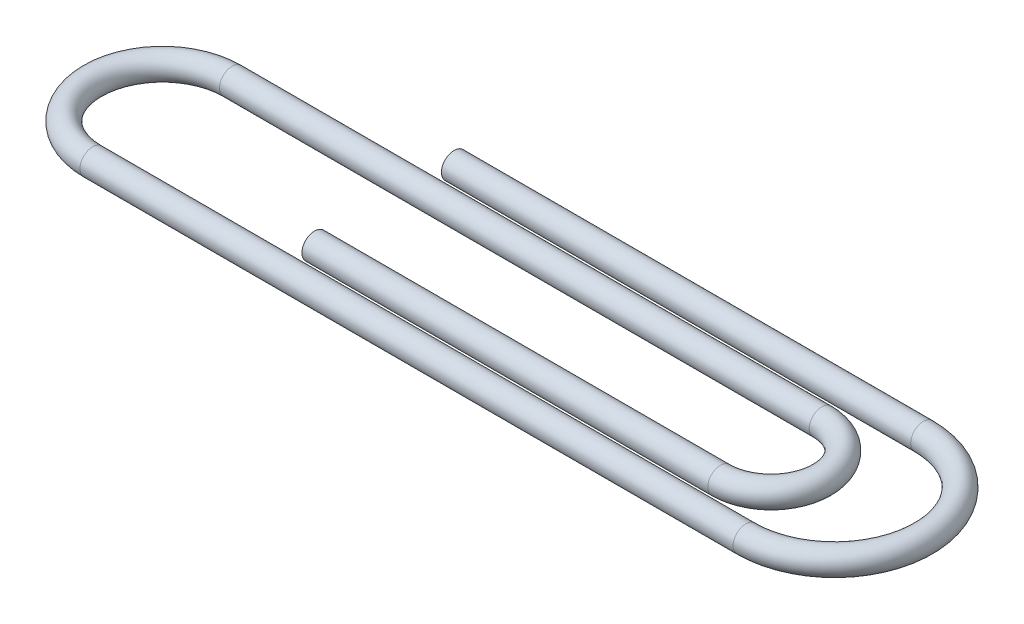
ISO-10303-21;
HEADER;
FILE_DESCRIPTION(('STEP AP214'),'2;1');
FILE_NAME('part.step','',(''),(''),'','','');
FILE_SCHEMA(('AUTOMOTIVE_DESIGN { 1 0 10303 214 1 1 1 1 }'));
ENDSEC;
DATA;
#1=APPLICATION_CONTEXT('core data for automotive mechanical design processes');
#2=APPLICATION_PROTOCOL_DEFINITION('international standard','automotive_design',2000,#1);
#3=PRODUCT_CONTEXT('',#1,'mechanical');
#4=PRODUCT('Part','Part','',(#3));
#5=PRODUCT_RELATED_PRODUCT_CATEGORY('part','',(#4));
#6=PRODUCT_DEFINITION_FORMATION('','',#4);
#7=PRODUCT_DEFINITION_CONTEXT('part definition',#1,'design');
#8=PRODUCT_DEFINITION('design','',#6,#7);
#9=PRODUCT_DEFINITION_SHAPE('','',#8);
#10=(LENGTH_UNIT() NAMED_UNIT(*) SI_UNIT(.MILLI.,.METRE.));
#11=(NAMED_UNIT(*) PLANE_ANGLE_UNIT() SI_UNIT($,.RADIAN.));
#12=(NAMED_UNIT(*) SI_UNIT($,.STERADIAN.) SOLID_ANGLE_UNIT());
#13=UNCERTAINTY_MEASURE_WITH_UNIT(LENGTH_MEASURE(1.E-05),#10,'distance_accuracy_value','');
#14=(GEOMETRIC_REPRESENTATION_CONTEXT(3) GLOBAL_UNCERTAINTY_ASSIGNED_CONTEXT((#13)) GLOBAL_UNIT_ASSIGNED_CONTEXT((#10,
#11,#12)) REPRESENTATION_CONTEXT('',''));
#15=CARTESIAN_POINT('',(0.,0.,0.));
#16=DIRECTION('',(0.,0.,1.));
#17=DIRECTION('',(1.,0.,0.));
#18=AXIS2_PLACEMENT_3D('',#15,#16,#17);
#19=CARTESIAN_POINT('',(0.,0.,0.));
#20=DIRECTION('',(1.,0.,0.));
#21=DIRECTION('',(0.,0.,-1.));
#22=AXIS2_PLACEMENT_3D('',#19,#20,#21);
#23=PLANE('',#22);
#24=CARTESIAN_POINT('',(0.,0.,0.));
#25=DIRECTION('',(1.,0.,0.));
#26=DIRECTION('',(0.,0.,-1.));
#27=AXIS2_PLACEMENT_3D('',#24,#25,#26);
#28=CIRCLE('',#27,0.5);
#29=CARTESIAN_POINT('',(0.,0.,-0.5));
#30=VERTEX_POINT('',#29);
#31=EDGE_CURVE('E72',#30,#30,#28,.T.);
#32=ORIENTED_EDGE('',*,*,#31,.F.);
#33=EDGE_LOOP('',(#32));
#34=FACE_BOUND('',#33,.T.);
#35=ADVANCED_FACE('F37',(#34),#23,.F.);
#36=CARTESIAN_POINT('',(0.,0.,5.5));
#37=DIRECTION('',(-1.,0.,0.));
#38=DIRECTION('',(0.,0.,1.));
#39=AXIS2_PLACEMENT_3D('',#36,#37,#38);
#40=PLANE('',#39);
#41=CARTESIAN_POINT('',(0.,0.,5.5));
#42=DIRECTION('',(-1.,0.,0.));
#43=DIRECTION('',(0.,0.,1.));
#44=AXIS2_PLACEMENT_3D('',#41,#42,#43);
#45=CIRCLE('',#44,0.5);
#46=CARTESIAN_POINT('',(0.,0.,6.));
#47=VERTEX_POINT('',#46);
#48=EDGE_CURVE('E10',#47,#47,#45,.T.);
#49=ORIENTED_EDGE('',*,*,#48,.T.);
#50=EDGE_LOOP('',(#49));
#51=FACE_BOUND('',#50,.T.);
#52=ADVANCED_FACE('F80',(#51),#40,.T.);
#53=CARTESIAN_POINT('',(0.,0.,0.));
#54=DIRECTION('',(1.,0.,0.));
#55=DIRECTION('',(0.,0.,-1.));
#56=AXIS2_PLACEMENT_3D('',#53,#54,#55);
#57=CYLINDRICAL_SURFACE('',#56,0.5);
#58=CARTESIAN_POINT('',(18.5,0.,0.));
#59=DIRECTION('',(1.,0.,0.));
#60=DIRECTION('',(0.,0.,-1.));
#61=AXIS2_PLACEMENT_3D('',#58,#59,#60);
#62=CIRCLE('',#61,0.5);
#63=CARTESIAN_POINT('',(18.5,0.,-0.5));
#64=VERTEX_POINT('',#63);
#65=EDGE_CURVE('E68',#64,#64,#62,.T.);
#66=ORIENTED_EDGE('',*,*,#65,.F.);
#67=EDGE_LOOP('',(#66));
#68=FACE_BOUND('',#67,.T.);
#69=ORIENTED_EDGE('',*,*,#31,.T.);
#70=EDGE_LOOP('',(#69));
#71=FACE_BOUND('',#70,.T.);
#72=ADVANCED_FACE('F77',(#68,#71),#57,.T.);
#73=CARTESIAN_POINT('',(18.5,0.,3.5));
#74=DIRECTION('',(0.,-1.,0.));
#75=DIRECTION('',(0.,0.,-1.));
#76=AXIS2_PLACEMENT_3D('',#73,#74,#75);
#77=TOROIDAL_SURFACE('',#76,3.5,0.5);
#78=CARTESIAN_POINT('',(18.5,0.,7.));
#79=DIRECTION('',(-1.,0.,0.));
#80=DIRECTION('',(0.,0.,1.));
#81=AXIS2_PLACEMENT_3D('',#78,#79,#80);
#82=CIRCLE('',#81,0.5);
#83=CARTESIAN_POINT('',(18.5,0.,7.5));
#84=VERTEX_POINT('',#83);
#85=EDGE_CURVE('E64',#84,#84,#82,.T.);
#86=CARTESIAN_POINT('',(18.5,0.,3.5));
#87=DIRECTION('',(0.,-1.,0.));
#88=DIRECTION('',(0.,0.,-1.));
#89=AXIS2_PLACEMENT_3D('',#86,#87,#88);
#90=CIRCLE('',#89,4.);
#91=EDGE_CURVE('',#64,#84,#90,.T.);
#92=ORIENTED_EDGE('',*,*,#65,.T.);
#93=ORIENTED_EDGE('',*,*,#85,.F.);
#94=ORIENTED_EDGE('',*,*,#91,.T.);
#95=ORIENTED_EDGE('',*,*,#91,.F.);
#96=EDGE_LOOP('',(#92,#94,#93,#95));
#97=FACE_BOUND('',#96,.T.);
#98=ADVANCED_FACE('F106',(#97),#77,.T.);
#99=CARTESIAN_POINT('',(18.5,0.,7.));
#100=DIRECTION('',(-1.,0.,0.));
#101=DIRECTION('',(0.,0.,1.));
#102=AXIS2_PLACEMENT_3D('',#99,#100,#101);
#103=CYLINDRICAL_SURFACE('',#102,0.5);
#104=CARTESIAN_POINT('',(-7.25,0.,7.));
#105=DIRECTION('',(-1.,0.,0.));
#106=DIRECTION('',(0.,0.,1.));
#107=AXIS2_PLACEMENT_3D('',#104,#105,#106);
#108=CIRCLE('',#107,0.5);
#109=CARTESIAN_POINT('',(-7.25,0.,7.5));
#110=VERTEX_POINT('',#109);
#111=EDGE_CURVE('E60',#110,#110,#108,.T.);
#112=ORIENTED_EDGE('',*,*,#111,.F.);
#113=EDGE_LOOP('',(#112));
#114=FACE_BOUND('',#113,.T.);
#115=ORIENTED_EDGE('',*,*,#85,.T.);
#116=EDGE_LOOP('',(#115));
#117=FACE_BOUND('',#116,.T.);
#118=ADVANCED_FACE('F102',(#114,#117),#103,.T.);
#119=CARTESIAN_POINT('',(-7.25,0.,4.25));
#120=DIRECTION('',(0.,-1.,0.));
#121=DIRECTION('',(0.,0.,-1.));
#122=AXIS2_PLACEMENT_3D('',#119,#120,#121);
#123=TOROIDAL_SURFACE('',#122,2.75,0.5);
#124=CARTESIAN_POINT('',(-7.25,0.,1.5));
#125=DIRECTION('',(1.,0.,0.));
#126=DIRECTION('',(0.,0.,-1.));
#127=AXIS2_PLACEMENT_3D('',#124,#125,#126);
#128=CIRCLE('',#127,0.5);
#129=CARTESIAN_POINT('',(-7.25,0.,1.));
#130=VERTEX_POINT('',#129);
#131=EDGE_CURVE('E54',#130,#130,#128,.T.);
#132=CARTESIAN_POINT('',(-7.25,0.,4.25));
#133=DIRECTION('',(0.,-1.,0.));
#134=DIRECTION('',(0.,0.,-1.));
#135=AXIS2_PLACEMENT_3D('',#132,#133,#134);
#136=CIRCLE('',#135,3.25);
#137=EDGE_CURVE('',#110,#130,#136,.T.);
#138=ORIENTED_EDGE('',*,*,#111,.T.);
#139=ORIENTED_EDGE('',*,*,#131,.F.);
#140=ORIENTED_EDGE('',*,*,#137,.T.);
#141=ORIENTED_EDGE('',*,*,#137,.F.);
#142=EDGE_LOOP('',(#138,#140,#139,#141));
#143=FACE_BOUND('',#142,.T.);
#144=ADVANCED_FACE('F98',(#143),#123,.T.);
#145=CARTESIAN_POINT('',(-7.25,0.,1.5));
#146=DIRECTION('',(1.,0.,0.));
#147=DIRECTION('',(0.,0.,-1.));
#148=AXIS2_PLACEMENT_3D('',#145,#146,#147);
#149=CYLINDRICAL_SURFACE('',#148,0.5);
#150=CARTESIAN_POINT('',(16.,0.,1.5));
#151=DIRECTION('',(1.,0.,0.));
#152=DIRECTION('',(0.,0.,-1.));
#153=AXIS2_PLACEMENT_3D('',#150,#151,#152);
#154=CIRCLE('',#153,0.5);
#155=CARTESIAN_POINT('',(16.,0.,1.));
#156=VERTEX_POINT('',#155);
#157=EDGE_CURVE('E49',#156,#156,#154,.T.);
#158=ORIENTED_EDGE('',*,*,#157,.F.);
#159=EDGE_LOOP('',(#158));
#160=FACE_BOUND('',#159,.T.);
#161=ORIENTED_EDGE('',*,*,#131,.T.);
#162=EDGE_LOOP('',(#161));
#163=FACE_BOUND('',#162,.T.);
#164=ADVANCED_FACE('F92',(#160,#163),#149,.T.);
#165=CARTESIAN_POINT('',(16.,0.,3.5));
#166=DIRECTION('',(0.,-1.,0.));
#167=DIRECTION('',(0.,0.,-1.));
#168=AXIS2_PLACEMENT_3D('',#165,#166,#167);
#169=TOROIDAL_SURFACE('',#168,2.,0.5);
#170=CARTESIAN_POINT('',(16.,0.,5.5));
#171=DIRECTION('',(-1.,0.,0.));
#172=DIRECTION('',(0.,0.,1.));
#173=AXIS2_PLACEMENT_3D('',#170,#171,#172);
#174=CIRCLE('',#173,0.5);
#175=CARTESIAN_POINT('',(16.,0.,6.));
#176=VERTEX_POINT('',#175);
#177=EDGE_CURVE('E44',#176,#176,#174,.T.);
#178=CARTESIAN_POINT('',(16.,0.,3.5));
#179=DIRECTION('',(0.,-1.,0.));
#180=DIRECTION('',(0.,0.,-1.));
#181=AXIS2_PLACEMENT_3D('',#178,#179,#180);
#182=CIRCLE('',#181,2.5);
#183=EDGE_CURVE('',#156,#176,#182,.T.);
#184=ORIENTED_EDGE('',*,*,#157,.T.);
#185=ORIENTED_EDGE('',*,*,#177,.F.);
#186=ORIENTED_EDGE('',*,*,#183,.T.);
#187=ORIENTED_EDGE('',*,*,#183,.F.);
#188=EDGE_LOOP('',(#184,#186,#185,#187));
#189=FACE_BOUND('',#188,.T.);
#190=ADVANCED_FACE('F86',(#189),#169,.T.);
#191=CARTESIAN_POINT('',(16.,0.,5.5));
#192=DIRECTION('',(-1.,0.,0.));
#193=DIRECTION('',(0.,0.,1.));
#194=AXIS2_PLACEMENT_3D('',#191,#192,#193);
#195=CYLINDRICAL_SURFACE('',#194,0.5);
#196=ORIENTED_EDGE('',*,*,#48,.F.);
#197=EDGE_LOOP('',(#196));
#198=FACE_BOUND('',#197,.T.);
#199=ORIENTED_EDGE('',*,*,#177,.T.);
#200=EDGE_LOOP('',(#199));
#201=FACE_BOUND('',#200,.T.);
#202=ADVANCED_FACE('F84',(#198,#201),#195,.T.);
#203=CLOSED_SHELL('',(#35,#52,#72,#98,#118,#144,#164,#190,#202));
#204=MANIFOLD_SOLID_BREP('B2',#203);
#205=ADVANCED_BREP_SHAPE_REPRESENTATION('',(#18,#204),#14);
#206=SHAPE_DEFINITION_REPRESENTATION(#9,#205);
ENDSEC;
END-ISO-10303-21;
